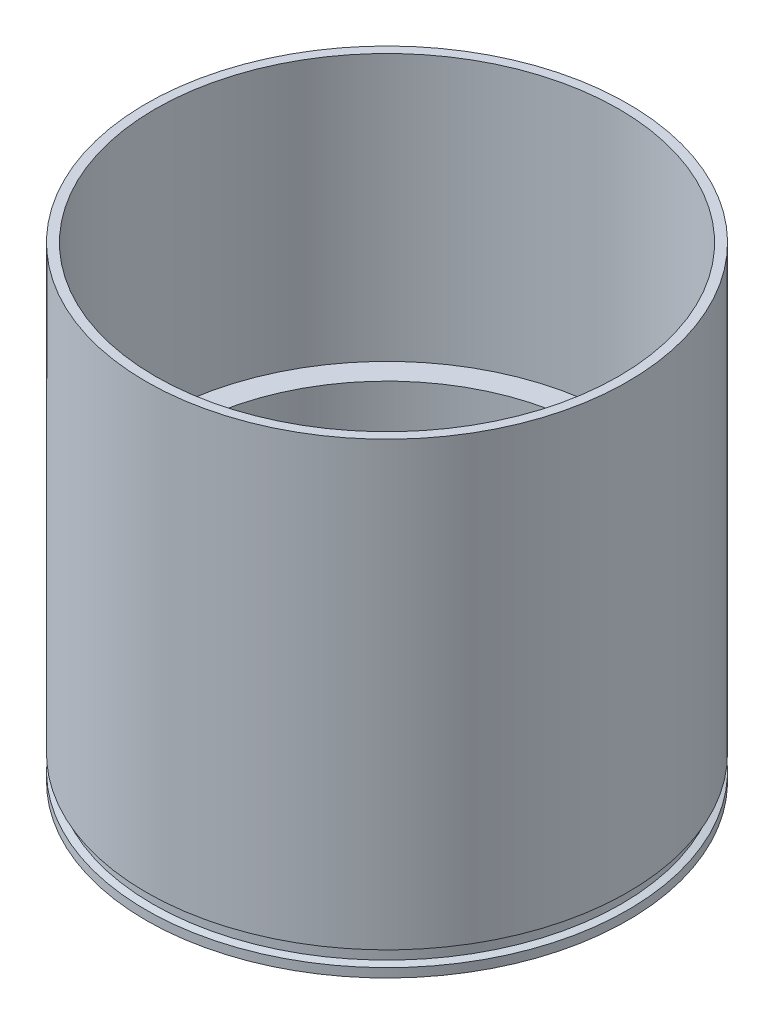
ISO-10303-21;
HEADER;
FILE_DESCRIPTION(('STEP AP214'),'2;1');
FILE_NAME('part.step','',(''),(''),'','','');
FILE_SCHEMA(('AUTOMOTIVE_DESIGN { 1 0 10303 214 1 1 1 1 }'));
ENDSEC;
DATA;
#1=APPLICATION_CONTEXT('core data for automotive mechanical design processes');
#2=APPLICATION_PROTOCOL_DEFINITION('international standard','automotive_design',2000,#1);
#3=PRODUCT_CONTEXT('',#1,'mechanical');
#4=PRODUCT('Part','Part','',(#3));
#5=PRODUCT_RELATED_PRODUCT_CATEGORY('part','',(#4));
#6=PRODUCT_DEFINITION_FORMATION('','',#4);
#7=PRODUCT_DEFINITION_CONTEXT('part definition',#1,'design');
#8=PRODUCT_DEFINITION('design','',#6,#7);
#9=PRODUCT_DEFINITION_SHAPE('','',#8);
#10=(LENGTH_UNIT() NAMED_UNIT(*) SI_UNIT(.MILLI.,.METRE.));
#11=(NAMED_UNIT(*) PLANE_ANGLE_UNIT() SI_UNIT($,.RADIAN.));
#12=(NAMED_UNIT(*) SI_UNIT($,.STERADIAN.) SOLID_ANGLE_UNIT());
#13=UNCERTAINTY_MEASURE_WITH_UNIT(LENGTH_MEASURE(1.E-05),#10,'distance_accuracy_value','');
#14=(GEOMETRIC_REPRESENTATION_CONTEXT(3) GLOBAL_UNCERTAINTY_ASSIGNED_CONTEXT((#13)) GLOBAL_UNIT_ASSIGNED_CONTEXT((#10,
#11,#12)) REPRESENTATION_CONTEXT('',''));
#15=CARTESIAN_POINT('',(0.,0.,0.));
#16=DIRECTION('',(0.,0.,1.));
#17=DIRECTION('',(1.,0.,0.));
#18=AXIS2_PLACEMENT_3D('',#15,#16,#17);
#19=CARTESIAN_POINT('',(0.,140.,0.));
#20=DIRECTION('',(0.,-1.,0.));
#21=DIRECTION('',(0.,0.,-1.));
#22=AXIS2_PLACEMENT_3D('',#19,#20,#21);
#23=CYLINDRICAL_SURFACE('',#22,72.25);
#24=CARTESIAN_POINT('',(0.,7.30384757729338,0.));
#25=DIRECTION('',(0.,1.,0.));
#26=DIRECTION('',(0.,0.,1.));
#27=AXIS2_PLACEMENT_3D('',#24,#25,#26);
#28=CIRCLE('',#27,72.25);
#29=CARTESIAN_POINT('',(0.,7.30384757729338,72.25));
#30=VERTEX_POINT('',#29);
#31=EDGE_CURVE('E41',#30,#30,#28,.T.);
#32=ORIENTED_EDGE('',*,*,#31,.T.);
#33=EDGE_LOOP('',(#32));
#34=FACE_BOUND('',#33,.T.);
#35=CARTESIAN_POINT('',(0.,140.,0.));
#36=DIRECTION('',(0.,1.,0.));
#37=DIRECTION('',(0.,0.,1.));
#38=AXIS2_PLACEMENT_3D('',#35,#36,#37);
#39=CIRCLE('',#38,72.25);
#40=CARTESIAN_POINT('',(0.,140.,72.25));
#41=VERTEX_POINT('',#40);
#42=EDGE_CURVE('E53',#41,#41,#39,.T.);
#43=ORIENTED_EDGE('',*,*,#42,.F.);
#44=EDGE_LOOP('',(#43));
#45=FACE_BOUND('',#44,.T.);
#46=ADVANCED_FACE('F33',(#34,#45),#23,.T.);
#47=CARTESIAN_POINT('',(0.,140.,0.));
#48=DIRECTION('',(0.,1.,0.));
#49=DIRECTION('',(0.,0.,1.));
#50=AXIS2_PLACEMENT_3D('',#47,#48,#49);
#51=PLANE('',#50);
#52=CARTESIAN_POINT('',(0.,140.,0.));
#53=DIRECTION('',(0.,1.,0.));
#54=DIRECTION('',(0.,0.,1.));
#55=AXIS2_PLACEMENT_3D('',#52,#53,#54);
#56=CIRCLE('',#55,69.5);
#57=CARTESIAN_POINT('',(0.,140.,69.5));
#58=VERTEX_POINT('',#57);
#59=EDGE_CURVE('E62',#58,#58,#56,.T.);
#60=ORIENTED_EDGE('',*,*,#59,.F.);
#61=EDGE_LOOP('',(#60));
#62=FACE_BOUND('',#61,.T.);
#63=ORIENTED_EDGE('',*,*,#42,.T.);
#64=EDGE_LOOP('',(#63));
#65=FACE_BOUND('',#64,.T.);
#66=ADVANCED_FACE('F88',(#62,#65),#51,.T.);
#67=CARTESIAN_POINT('',(0.,0.,0.));
#68=DIRECTION('',(0.,-1.,0.));
#69=DIRECTION('',(0.,0.,-1.));
#70=AXIS2_PLACEMENT_3D('',#67,#68,#69);
#71=CYLINDRICAL_SURFACE('',#70,70.25);
#72=CARTESIAN_POINT('',(0.,6.76794919243113,0.));
#73=DIRECTION('',(0.,1.,0.));
#74=DIRECTION('',(0.,0.,1.));
#75=AXIS2_PLACEMENT_3D('',#72,#73,#74);
#76=CIRCLE('',#75,70.25);
#77=CARTESIAN_POINT('',(0.,6.76794919243113,70.25));
#78=VERTEX_POINT('',#77);
#79=EDGE_CURVE('E10',#78,#78,#76,.F.);
#80=ORIENTED_EDGE('',*,*,#79,.T.);
#81=EDGE_LOOP('',(#80));
#82=FACE_BOUND('',#81,.T.);
#83=CARTESIAN_POINT('',(0.,3.23205080756887,0.));
#84=DIRECTION('',(0.,-1.,0.));
#85=DIRECTION('',(0.,0.,-1.));
#86=AXIS2_PLACEMENT_3D('',#83,#84,#85);
#87=CIRCLE('',#86,70.25);
#88=CARTESIAN_POINT('',(0.,3.23205080756887,-70.25));
#89=VERTEX_POINT('',#88);
#90=EDGE_CURVE('E45',#89,#89,#87,.F.);
#91=ORIENTED_EDGE('',*,*,#90,.T.);
#92=EDGE_LOOP('',(#91));
#93=FACE_BOUND('',#92,.T.);
#94=ADVANCED_FACE('F95',(#82,#93),#71,.T.);
#95=CARTESIAN_POINT('',(0.,0.,0.));
#96=DIRECTION('',(0.,1.,0.));
#97=DIRECTION('',(0.,0.,1.));
#98=AXIS2_PLACEMENT_3D('',#95,#96,#97);
#99=PLANE('',#98);
#100=CARTESIAN_POINT('',(0.,0.,0.));
#101=DIRECTION('',(0.,1.,0.));
#102=DIRECTION('',(0.,0.,1.));
#103=AXIS2_PLACEMENT_3D('',#100,#101,#102);
#104=CIRCLE('',#103,72.25);
#105=CARTESIAN_POINT('',(0.,0.,72.25));
#106=VERTEX_POINT('',#105);
#107=EDGE_CURVE('E54',#106,#106,#104,.T.);
#108=ORIENTED_EDGE('',*,*,#107,.F.);
#109=EDGE_LOOP('',(#108));
#110=FACE_BOUND('',#109,.T.);
#111=ADVANCED_FACE('F102',(#110),#99,.F.);
#112=CARTESIAN_POINT('',(0.,2.6961524227066,0.));
#113=DIRECTION('',(0.,-1.,0.));
#114=DIRECTION('',(0.,0.,-1.));
#115=AXIS2_PLACEMENT_3D('',#112,#113,#114);
#116=CIRCLE('',#115,72.25);
#117=CARTESIAN_POINT('',(0.,2.6961524227066,-72.25));
#118=VERTEX_POINT('',#117);
#119=EDGE_CURVE('E50',#118,#118,#116,.T.);
#120=ORIENTED_EDGE('',*,*,#119,.T.);
#121=EDGE_LOOP('',(#120));
#122=FACE_BOUND('',#121,.T.);
#123=ORIENTED_EDGE('',*,*,#107,.T.);
#124=EDGE_LOOP('',(#123));
#125=FACE_BOUND('',#124,.T.);
#126=ADVANCED_FACE('F91',(#122,#125),#23,.T.);
#127=CARTESIAN_POINT('',(0.,2.6961524227066,0.));
#128=DIRECTION('',(0.,-1.,0.));
#129=DIRECTION('',(0.,0.,-1.));
#130=AXIS2_PLACEMENT_3D('',#127,#128,#129);
#131=CONICAL_SURFACE('',#130,72.25,1.30899693899574);
#132=ORIENTED_EDGE('',*,*,#90,.F.);
#133=EDGE_LOOP('',(#132));
#134=FACE_BOUND('',#133,.T.);
#135=ORIENTED_EDGE('',*,*,#119,.F.);
#136=EDGE_LOOP('',(#135));
#137=FACE_BOUND('',#136,.T.);
#138=ADVANCED_FACE('F101',(#134,#137),#131,.T.);
#139=CARTESIAN_POINT('',(0.,6.50000000000001,0.));
#140=DIRECTION('',(0.,1.,0.));
#141=DIRECTION('',(0.,0.,1.));
#142=AXIS2_PLACEMENT_3D('',#139,#140,#141);
#143=CONICAL_SURFACE('',#142,69.25,1.30899693899574);
#144=ORIENTED_EDGE('',*,*,#31,.F.);
#145=EDGE_LOOP('',(#144));
#146=FACE_BOUND('',#145,.T.);
#147=ORIENTED_EDGE('',*,*,#79,.F.);
#148=EDGE_LOOP('',(#147));
#149=FACE_BOUND('',#148,.T.);
#150=ADVANCED_FACE('F35',(#146,#149),#143,.T.);
#151=CARTESIAN_POINT('',(0.,60.,0.));
#152=DIRECTION('',(0.,1.,0.));
#153=DIRECTION('',(0.,0.,1.));
#154=AXIS2_PLACEMENT_3D('',#151,#152,#153);
#155=PLANE('',#154);
#156=CARTESIAN_POINT('',(0.,60.,0.));
#157=DIRECTION('',(0.,1.,0.));
#158=DIRECTION('',(0.,0.,1.));
#159=AXIS2_PLACEMENT_3D('',#156,#157,#158);
#160=CIRCLE('',#159,69.5);
#161=CARTESIAN_POINT('',(0.,60.,69.5));
#162=VERTEX_POINT('',#161);
#163=EDGE_CURVE('E65',#162,#162,#160,.T.);
#164=ORIENTED_EDGE('',*,*,#163,.T.);
#165=EDGE_LOOP('',(#164));
#166=FACE_BOUND('',#165,.T.);
#167=CARTESIAN_POINT('',(0.,60.,0.));
#168=DIRECTION('',(0.,1.,0.));
#169=DIRECTION('',(0.,0.,1.));
#170=AXIS2_PLACEMENT_3D('',#167,#168,#169);
#171=CIRCLE('',#170,62.25);
#172=CARTESIAN_POINT('',(0.,60.,62.25));
#173=VERTEX_POINT('',#172);
#174=EDGE_CURVE('E37',#173,#173,#171,.F.);
#175=ORIENTED_EDGE('',*,*,#174,.T.);
#176=EDGE_LOOP('',(#175));
#177=FACE_BOUND('',#176,.T.);
#178=ADVANCED_FACE('F72',(#166,#177),#155,.T.);
#179=CARTESIAN_POINT('',(0.,60.,0.));
#180=DIRECTION('',(0.,1.,0.));
#181=DIRECTION('',(0.,0.,1.));
#182=AXIS2_PLACEMENT_3D('',#179,#180,#181);
#183=CYLINDRICAL_SURFACE('',#182,69.5);
#184=ORIENTED_EDGE('',*,*,#163,.F.);
#185=EDGE_LOOP('',(#184));
#186=FACE_BOUND('',#185,.T.);
#187=ORIENTED_EDGE('',*,*,#59,.T.);
#188=EDGE_LOOP('',(#187));
#189=FACE_BOUND('',#188,.T.);
#190=ADVANCED_FACE('F82',(#186,#189),#183,.F.);
#191=CARTESIAN_POINT('',(0.,5.,0.));
#192=DIRECTION('',(0.,1.,0.));
#193=DIRECTION('',(0.,0.,1.));
#194=AXIS2_PLACEMENT_3D('',#191,#192,#193);
#195=PLANE('',#194);
#196=CARTESIAN_POINT('',(0.,5.,0.));
#197=DIRECTION('',(0.,1.,0.));
#198=DIRECTION('',(0.,0.,1.));
#199=AXIS2_PLACEMENT_3D('',#196,#197,#198);
#200=CIRCLE('',#199,62.25);
#201=CARTESIAN_POINT('',(0.,5.,62.25));
#202=VERTEX_POINT('',#201);
#203=EDGE_CURVE('E57',#202,#202,#200,.T.);
#204=ORIENTED_EDGE('',*,*,#203,.T.);
#205=EDGE_LOOP('',(#204));
#206=FACE_BOUND('',#205,.T.);
#207=ADVANCED_FACE('F76',(#206),#195,.T.);
#208=CARTESIAN_POINT('',(0.,5.,0.));
#209=DIRECTION('',(0.,1.,0.));
#210=DIRECTION('',(0.,0.,1.));
#211=AXIS2_PLACEMENT_3D('',#208,#209,#210);
#212=CYLINDRICAL_SURFACE('',#211,62.25);
#213=ORIENTED_EDGE('',*,*,#203,.F.);
#214=EDGE_LOOP('',(#213));
#215=FACE_BOUND('',#214,.T.);
#216=ORIENTED_EDGE('',*,*,#174,.F.);
#217=EDGE_LOOP('',(#216));
#218=FACE_BOUND('',#217,.T.);
#219=ADVANCED_FACE('F74',(#215,#218),#212,.F.);
#220=CLOSED_SHELL('',(#46,#66,#94,#111,#126,#138,#150,#178,#190,#207,#219));
#221=MANIFOLD_SOLID_BREP('B2',#220);
#222=ADVANCED_BREP_SHAPE_REPRESENTATION('',(#18,#221),#14);
#223=SHAPE_DEFINITION_REPRESENTATION(#9,#222);
ENDSEC;
END-ISO-10303-21;
